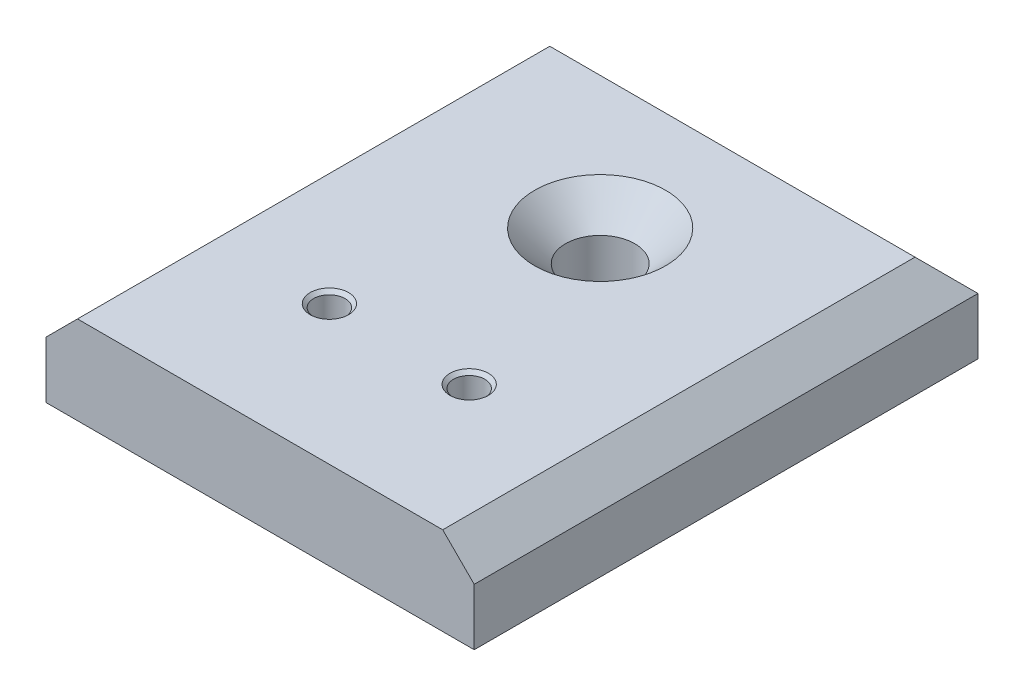
ISO-10303-21;
HEADER;
FILE_DESCRIPTION(('STEP AP214'),'2;1');
FILE_NAME('part.step','',(''),(''),'','','');
FILE_SCHEMA(('AUTOMOTIVE_DESIGN { 1 0 10303 214 1 1 1 1 }'));
ENDSEC;
DATA;
#1=APPLICATION_CONTEXT('core data for automotive mechanical design processes');
#2=APPLICATION_PROTOCOL_DEFINITION('international standard','automotive_design',2000,#1);
#3=PRODUCT_CONTEXT('',#1,'mechanical');
#4=PRODUCT('Part','Part','',(#3));
#5=PRODUCT_RELATED_PRODUCT_CATEGORY('part','',(#4));
#6=PRODUCT_DEFINITION_FORMATION('','',#4);
#7=PRODUCT_DEFINITION_CONTEXT('part definition',#1,'design');
#8=PRODUCT_DEFINITION('design','',#6,#7);
#9=PRODUCT_DEFINITION_SHAPE('','',#8);
#10=(LENGTH_UNIT() NAMED_UNIT(*) SI_UNIT(.MILLI.,.METRE.));
#11=(NAMED_UNIT(*) PLANE_ANGLE_UNIT() SI_UNIT($,.RADIAN.));
#12=(NAMED_UNIT(*) SI_UNIT($,.STERADIAN.) SOLID_ANGLE_UNIT());
#13=UNCERTAINTY_MEASURE_WITH_UNIT(LENGTH_MEASURE(1.E-05),#10,'distance_accuracy_value','');
#14=(GEOMETRIC_REPRESENTATION_CONTEXT(3) GLOBAL_UNCERTAINTY_ASSIGNED_CONTEXT((#13)) GLOBAL_UNIT_ASSIGNED_CONTEXT((#10,
#11,#12)) REPRESENTATION_CONTEXT('',''));
#15=CARTESIAN_POINT('',(0.,0.,0.));
#16=DIRECTION('',(0.,0.,1.));
#17=DIRECTION('',(1.,0.,0.));
#18=AXIS2_PLACEMENT_3D('',#15,#16,#17);
#19=CARTESIAN_POINT('',(17.,7.,-20.));
#20=DIRECTION('',(-1.,0.,0.));
#21=DIRECTION('',(0.,0.,1.));
#22=AXIS2_PLACEMENT_3D('',#19,#20,#21);
#23=PLANE('',#22);
#24=DIRECTION('',(0.,-1.,0.));
#25=VECTOR('',#24,1.);
#26=CARTESIAN_POINT('',(17.,7.,-20.));
#27=LINE('',#26,#25);
#28=CARTESIAN_POINT('',(17.,4.49999999999999,-20.));
#29=VERTEX_POINT('',#28);
#30=CARTESIAN_POINT('',(17.,0.,-20.));
#31=VERTEX_POINT('',#30);
#32=EDGE_CURVE('E91',#29,#31,#27,.T.);
#33=ORIENTED_EDGE('',*,*,#32,.F.);
#34=DIRECTION('',(0.,0.,1.));
#35=VECTOR('',#34,1.);
#36=CARTESIAN_POINT('',(17.,4.49999999999999,20.));
#37=LINE('',#36,#35);
#38=CARTESIAN_POINT('',(17.,4.49999999999999,20.));
#39=VERTEX_POINT('',#38);
#40=EDGE_CURVE('E135',#29,#39,#37,.T.);
#41=ORIENTED_EDGE('',*,*,#40,.T.);
#42=DIRECTION('',(0.,-1.,0.));
#43=VECTOR('',#42,1.);
#44=CARTESIAN_POINT('',(17.,7.,20.));
#45=LINE('',#44,#43);
#46=CARTESIAN_POINT('',(17.,0.,20.));
#47=VERTEX_POINT('',#46);
#48=EDGE_CURVE('E112',#39,#47,#45,.T.);
#49=ORIENTED_EDGE('',*,*,#48,.T.);
#50=DIRECTION('',(0.,0.,-1.));
#51=VECTOR('',#50,1.);
#52=CARTESIAN_POINT('',(17.,0.,-20.));
#53=LINE('',#52,#51);
#54=EDGE_CURVE('E107',#47,#31,#53,.T.);
#55=ORIENTED_EDGE('',*,*,#54,.T.);
#56=EDGE_LOOP('',(#33,#41,#49,#55));
#57=FACE_BOUND('',#56,.T.);
#58=ADVANCED_FACE('F37',(#57),#23,.F.);
#59=CARTESIAN_POINT('',(-17.,7.,-20.));
#60=DIRECTION('',(0.,0.,1.));
#61=DIRECTION('',(1.,0.,0.));
#62=AXIS2_PLACEMENT_3D('',#59,#60,#61);
#63=PLANE('',#62);
#64=DIRECTION('',(0.,-1.,0.));
#65=VECTOR('',#64,1.);
#66=CARTESIAN_POINT('',(-17.,7.,-20.));
#67=LINE('',#66,#65);
#68=CARTESIAN_POINT('',(-17.,4.49999999999999,-20.));
#69=VERTEX_POINT('',#68);
#70=CARTESIAN_POINT('',(-17.,0.,-20.));
#71=VERTEX_POINT('',#70);
#72=EDGE_CURVE('E101',#69,#71,#67,.T.);
#73=ORIENTED_EDGE('',*,*,#72,.F.);
#74=DIRECTION('',(1.,0.,0.));
#75=VECTOR('',#74,1.);
#76=CARTESIAN_POINT('',(17.,4.49999999999999,-20.));
#77=LINE('',#76,#75);
#78=EDGE_CURVE('E46',#69,#29,#77,.T.);
#79=ORIENTED_EDGE('',*,*,#78,.T.);
#80=ORIENTED_EDGE('',*,*,#32,.T.);
#81=DIRECTION('',(-1.,0.,0.));
#82=VECTOR('',#81,1.);
#83=CARTESIAN_POINT('',(-17.,0.,-20.));
#84=LINE('',#83,#82);
#85=EDGE_CURVE('E94',#31,#71,#84,.T.);
#86=ORIENTED_EDGE('',*,*,#85,.T.);
#87=EDGE_LOOP('',(#73,#79,#80,#86));
#88=FACE_BOUND('',#87,.T.);
#89=ADVANCED_FACE('F93',(#88),#63,.F.);
#90=CARTESIAN_POINT('',(-17.,7.,-20.));
#91=DIRECTION('',(1.,0.,0.));
#92=DIRECTION('',(0.,0.,-1.));
#93=AXIS2_PLACEMENT_3D('',#90,#91,#92);
#94=PLANE('',#93);
#95=DIRECTION('',(0.,-1.,0.));
#96=VECTOR('',#95,1.);
#97=CARTESIAN_POINT('',(-17.,7.,20.));
#98=LINE('',#97,#96);
#99=CARTESIAN_POINT('',(-17.,4.49999999999999,20.));
#100=VERTEX_POINT('',#99);
#101=CARTESIAN_POINT('',(-17.,0.,20.));
#102=VERTEX_POINT('',#101);
#103=EDGE_CURVE('E126',#100,#102,#98,.T.);
#104=ORIENTED_EDGE('',*,*,#103,.F.);
#105=DIRECTION('',(0.,0.,-1.));
#106=VECTOR('',#105,1.);
#107=CARTESIAN_POINT('',(-17.,4.49999999999999,-20.));
#108=LINE('',#107,#106);
#109=EDGE_CURVE('E11',#100,#69,#108,.T.);
#110=ORIENTED_EDGE('',*,*,#109,.T.);
#111=ORIENTED_EDGE('',*,*,#72,.T.);
#112=DIRECTION('',(0.,0.,1.));
#113=VECTOR('',#112,1.);
#114=CARTESIAN_POINT('',(-17.,0.,-20.));
#115=LINE('',#114,#113);
#116=EDGE_CURVE('E109',#71,#102,#115,.T.);
#117=ORIENTED_EDGE('',*,*,#116,.T.);
#118=EDGE_LOOP('',(#104,#110,#111,#117));
#119=FACE_BOUND('',#118,.T.);
#120=ADVANCED_FACE('F194',(#119),#94,.F.);
#121=CARTESIAN_POINT('',(-17.,7.,20.));
#122=DIRECTION('',(0.,0.,-1.));
#123=DIRECTION('',(-1.,0.,0.));
#124=AXIS2_PLACEMENT_3D('',#121,#122,#123);
#125=PLANE('',#124);
#126=ORIENTED_EDGE('',*,*,#48,.F.);
#127=DIRECTION('',(-0.707106781186546,0.70710678118655,0.));
#128=VECTOR('',#127,1.);
#129=CARTESIAN_POINT('',(14.5,7.,20.));
#130=LINE('',#129,#128);
#131=CARTESIAN_POINT('',(14.5,7.,20.));
#132=VERTEX_POINT('',#131);
#133=EDGE_CURVE('E138',#39,#132,#130,.T.);
#134=ORIENTED_EDGE('',*,*,#133,.T.);
#135=DIRECTION('',(1.,0.,0.));
#136=VECTOR('',#135,1.);
#137=CARTESIAN_POINT('',(-17.,7.,20.));
#138=LINE('',#137,#136);
#139=CARTESIAN_POINT('',(-14.5,7.,20.));
#140=VERTEX_POINT('',#139);
#141=EDGE_CURVE('E120',#140,#132,#138,.T.);
#142=ORIENTED_EDGE('',*,*,#141,.F.);
#143=DIRECTION('',(-0.707106781186546,-0.70710678118655,0.));
#144=VECTOR('',#143,1.);
#145=CARTESIAN_POINT('',(-14.5,7.,20.));
#146=LINE('',#145,#144);
#147=EDGE_CURVE('E60',#140,#100,#146,.T.);
#148=ORIENTED_EDGE('',*,*,#147,.T.);
#149=ORIENTED_EDGE('',*,*,#103,.T.);
#150=DIRECTION('',(1.,0.,0.));
#151=VECTOR('',#150,1.);
#152=CARTESIAN_POINT('',(-17.,0.,20.));
#153=LINE('',#152,#151);
#154=EDGE_CURVE('E123',#102,#47,#153,.T.);
#155=ORIENTED_EDGE('',*,*,#154,.T.);
#156=EDGE_LOOP('',(#126,#134,#142,#148,#149,#155));
#157=FACE_BOUND('',#156,.T.);
#158=ADVANCED_FACE('F187',(#157),#125,.F.);
#159=CARTESIAN_POINT('',(0.,7.,0.));
#160=DIRECTION('',(0.,1.,0.));
#161=DIRECTION('',(0.,0.,1.));
#162=AXIS2_PLACEMENT_3D('',#159,#160,#161);
#163=PLANE('',#162);
#164=CARTESIAN_POINT('',(-5.54999999999931,7.,8.94999999999997));
#165=DIRECTION('',(0.,1.,0.));
#166=DIRECTION('',(0.,0.,1.));
#167=AXIS2_PLACEMENT_3D('',#164,#165,#166);
#168=CIRCLE('',#167,1.525);
#169=CARTESIAN_POINT('',(-5.54999999999931,7.,10.475));
#170=VERTEX_POINT('',#169);
#171=EDGE_CURVE('E146',#170,#170,#168,.T.);
#172=ORIENTED_EDGE('',*,*,#171,.F.);
#173=EDGE_LOOP('',(#172));
#174=FACE_BOUND('',#173,.T.);
#175=CARTESIAN_POINT('',(5.54999999999931,7.,8.94999999999997));
#176=DIRECTION('',(0.,1.,0.));
#177=DIRECTION('',(0.,0.,1.));
#178=AXIS2_PLACEMENT_3D('',#175,#176,#177);
#179=CIRCLE('',#178,1.525);
#180=CARTESIAN_POINT('',(5.54999999999931,7.,10.475));
#181=VERTEX_POINT('',#180);
#182=EDGE_CURVE('E160',#181,#181,#179,.T.);
#183=ORIENTED_EDGE('',*,*,#182,.F.);
#184=EDGE_LOOP('',(#183));
#185=FACE_BOUND('',#184,.T.);
#186=CARTESIAN_POINT('',(0.,7.,-7.00000000000001));
#187=DIRECTION('',(0.,1.,0.));
#188=DIRECTION('',(0.,0.,1.));
#189=AXIS2_PLACEMENT_3D('',#186,#187,#188);
#190=CIRCLE('',#189,5.2);
#191=CARTESIAN_POINT('',(0.,7.,-1.80000000000001));
#192=VERTEX_POINT('',#191);
#193=EDGE_CURVE('E169',#192,#192,#190,.T.);
#194=ORIENTED_EDGE('',*,*,#193,.F.);
#195=EDGE_LOOP('',(#194));
#196=FACE_BOUND('',#195,.T.);
#197=ORIENTED_EDGE('',*,*,#141,.T.);
#198=DIRECTION('',(0.,0.,-1.));
#199=VECTOR('',#198,1.);
#200=CARTESIAN_POINT('',(14.5,7.,-20.));
#201=LINE('',#200,#199);
#202=CARTESIAN_POINT('',(14.5,7.,-17.5));
#203=VERTEX_POINT('',#202);
#204=EDGE_CURVE('E132',#132,#203,#201,.T.);
#205=ORIENTED_EDGE('',*,*,#204,.T.);
#206=DIRECTION('',(-1.,0.,0.));
#207=VECTOR('',#206,1.);
#208=CARTESIAN_POINT('',(-17.,7.,-17.5));
#209=LINE('',#208,#207);
#210=CARTESIAN_POINT('',(-14.5,7.,-17.5));
#211=VERTEX_POINT('',#210);
#212=EDGE_CURVE('E130',#203,#211,#209,.T.);
#213=ORIENTED_EDGE('',*,*,#212,.T.);
#214=DIRECTION('',(0.,0.,1.));
#215=VECTOR('',#214,1.);
#216=CARTESIAN_POINT('',(-14.5,7.,20.));
#217=LINE('',#216,#215);
#218=EDGE_CURVE('E100',#211,#140,#217,.T.);
#219=ORIENTED_EDGE('',*,*,#218,.T.);
#220=EDGE_LOOP('',(#197,#205,#213,#219));
#221=FACE_BOUND('',#220,.T.);
#222=ADVANCED_FACE('F184',(#174,#185,#196,#221),#163,.T.);
#223=CARTESIAN_POINT('',(0.,0.,0.));
#224=DIRECTION('',(0.,1.,0.));
#225=DIRECTION('',(0.,0.,1.));
#226=AXIS2_PLACEMENT_3D('',#223,#224,#225);
#227=PLANE('',#226);
#228=CARTESIAN_POINT('',(-5.54999999999931,0.,8.94999999999997));
#229=DIRECTION('',(0.,1.,0.));
#230=DIRECTION('',(0.,0.,1.));
#231=AXIS2_PLACEMENT_3D('',#228,#229,#230);
#232=CIRCLE('',#231,1.25);
#233=CARTESIAN_POINT('',(-5.54999999999931,0.,10.2));
#234=VERTEX_POINT('',#233);
#235=EDGE_CURVE('E155',#234,#234,#232,.T.);
#236=ORIENTED_EDGE('',*,*,#235,.T.);
#237=EDGE_LOOP('',(#236));
#238=FACE_BOUND('',#237,.T.);
#239=CARTESIAN_POINT('',(5.54999999999931,0.,8.94999999999997));
#240=DIRECTION('',(0.,1.,0.));
#241=DIRECTION('',(0.,0.,1.));
#242=AXIS2_PLACEMENT_3D('',#239,#240,#241);
#243=CIRCLE('',#242,1.25);
#244=CARTESIAN_POINT('',(5.54999999999931,0.,10.2));
#245=VERTEX_POINT('',#244);
#246=EDGE_CURVE('E166',#245,#245,#243,.T.);
#247=ORIENTED_EDGE('',*,*,#246,.T.);
#248=EDGE_LOOP('',(#247));
#249=FACE_BOUND('',#248,.T.);
#250=CARTESIAN_POINT('',(0.,0.,-7.00000000000001));
#251=DIRECTION('',(0.,1.,0.));
#252=DIRECTION('',(0.,0.,1.));
#253=AXIS2_PLACEMENT_3D('',#250,#251,#252);
#254=CIRCLE('',#253,2.75);
#255=CARTESIAN_POINT('',(0.,0.,-4.25000000000001));
#256=VERTEX_POINT('',#255);
#257=EDGE_CURVE('E114',#256,#256,#254,.T.);
#258=ORIENTED_EDGE('',*,*,#257,.T.);
#259=EDGE_LOOP('',(#258));
#260=FACE_BOUND('',#259,.T.);
#261=ORIENTED_EDGE('',*,*,#54,.F.);
#262=ORIENTED_EDGE('',*,*,#154,.F.);
#263=ORIENTED_EDGE('',*,*,#116,.F.);
#264=ORIENTED_EDGE('',*,*,#85,.F.);
#265=EDGE_LOOP('',(#261,#262,#263,#264));
#266=FACE_BOUND('',#265,.T.);
#267=ADVANCED_FACE('F105',(#238,#249,#260,#266),#227,.F.);
#268=CARTESIAN_POINT('',(0.,7.,-7.00000000000001));
#269=DIRECTION('',(0.,1.,0.));
#270=DIRECTION('',(0.,0.,1.));
#271=AXIS2_PLACEMENT_3D('',#268,#269,#270);
#272=CYLINDRICAL_SURFACE('',#271,2.74999999999999);
#273=ORIENTED_EDGE('',*,*,#257,.F.);
#274=EDGE_LOOP('',(#273));
#275=FACE_BOUND('',#274,.T.);
#276=CARTESIAN_POINT('',(0.,4.54999999999999,-7.00000000000001));
#277=DIRECTION('',(0.,1.,0.));
#278=DIRECTION('',(0.,0.,1.));
#279=AXIS2_PLACEMENT_3D('',#276,#277,#278);
#280=CIRCLE('',#279,2.74999999999999);
#281=CARTESIAN_POINT('',(0.,4.54999999999999,-4.25000000000002));
#282=VERTEX_POINT('',#281);
#283=EDGE_CURVE('E117',#282,#282,#280,.T.);
#284=ORIENTED_EDGE('',*,*,#283,.T.);
#285=EDGE_LOOP('',(#284));
#286=FACE_BOUND('',#285,.T.);
#287=ADVANCED_FACE('F175',(#275,#286),#272,.F.);
#288=CARTESIAN_POINT('',(0.,7.,-7.00000000000001));
#289=DIRECTION('',(0.,1.,0.));
#290=DIRECTION('',(0.,0.,1.));
#291=AXIS2_PLACEMENT_3D('',#288,#289,#290);
#292=CONICAL_SURFACE('',#291,5.2,0.785398163397449);
#293=ORIENTED_EDGE('',*,*,#283,.F.);
#294=EDGE_LOOP('',(#293));
#295=FACE_BOUND('',#294,.T.);
#296=ORIENTED_EDGE('',*,*,#193,.T.);
#297=EDGE_LOOP('',(#296));
#298=FACE_BOUND('',#297,.T.);
#299=ADVANCED_FACE('F177',(#295,#298),#292,.F.);
#300=CARTESIAN_POINT('',(5.54999999999931,7.,8.94999999999997));
#301=DIRECTION('',(0.,1.,0.));
#302=DIRECTION('',(0.,0.,1.));
#303=AXIS2_PLACEMENT_3D('',#300,#301,#302);
#304=CYLINDRICAL_SURFACE('',#303,1.25);
#305=ORIENTED_EDGE('',*,*,#246,.F.);
#306=EDGE_LOOP('',(#305));
#307=FACE_BOUND('',#306,.T.);
#308=CARTESIAN_POINT('',(5.54999999999931,6.725,8.94999999999997));
#309=DIRECTION('',(0.,1.,0.));
#310=DIRECTION('',(0.,0.,1.));
#311=AXIS2_PLACEMENT_3D('',#308,#309,#310);
#312=CIRCLE('',#311,1.25);
#313=CARTESIAN_POINT('',(5.54999999999931,6.725,10.2));
#314=VERTEX_POINT('',#313);
#315=EDGE_CURVE('E163',#314,#314,#312,.T.);
#316=ORIENTED_EDGE('',*,*,#315,.T.);
#317=EDGE_LOOP('',(#316));
#318=FACE_BOUND('',#317,.T.);
#319=ADVANCED_FACE('F180',(#307,#318),#304,.F.);
#320=CARTESIAN_POINT('',(5.54999999999931,7.,8.94999999999997));
#321=DIRECTION('',(0.,1.,0.));
#322=DIRECTION('',(0.,0.,1.));
#323=AXIS2_PLACEMENT_3D('',#320,#321,#322);
#324=CONICAL_SURFACE('',#323,1.525,0.785398163397453);
#325=ORIENTED_EDGE('',*,*,#315,.F.);
#326=EDGE_LOOP('',(#325));
#327=FACE_BOUND('',#326,.T.);
#328=ORIENTED_EDGE('',*,*,#182,.T.);
#329=EDGE_LOOP('',(#328));
#330=FACE_BOUND('',#329,.T.);
#331=ADVANCED_FACE('F223',(#327,#330),#324,.F.);
#332=CARTESIAN_POINT('',(-5.54999999999931,7.,8.94999999999997));
#333=DIRECTION('',(0.,1.,0.));
#334=DIRECTION('',(0.,0.,1.));
#335=AXIS2_PLACEMENT_3D('',#332,#333,#334);
#336=CYLINDRICAL_SURFACE('',#335,1.25);
#337=ORIENTED_EDGE('',*,*,#235,.F.);
#338=EDGE_LOOP('',(#337));
#339=FACE_BOUND('',#338,.T.);
#340=CARTESIAN_POINT('',(-5.54999999999931,6.725,8.94999999999997));
#341=DIRECTION('',(0.,1.,0.));
#342=DIRECTION('',(0.,0.,1.));
#343=AXIS2_PLACEMENT_3D('',#340,#341,#342);
#344=CIRCLE('',#343,1.25);
#345=CARTESIAN_POINT('',(-5.54999999999931,6.725,10.2));
#346=VERTEX_POINT('',#345);
#347=EDGE_CURVE('E150',#346,#346,#344,.T.);
#348=ORIENTED_EDGE('',*,*,#347,.T.);
#349=EDGE_LOOP('',(#348));
#350=FACE_BOUND('',#349,.T.);
#351=ADVANCED_FACE('F227',(#339,#350),#336,.F.);
#352=CARTESIAN_POINT('',(-5.54999999999931,7.,8.94999999999997));
#353=DIRECTION('',(0.,1.,0.));
#354=DIRECTION('',(0.,0.,1.));
#355=AXIS2_PLACEMENT_3D('',#352,#353,#354);
#356=CONICAL_SURFACE('',#355,1.525,0.785398163397453);
#357=ORIENTED_EDGE('',*,*,#347,.F.);
#358=EDGE_LOOP('',(#357));
#359=FACE_BOUND('',#358,.T.);
#360=ORIENTED_EDGE('',*,*,#171,.T.);
#361=EDGE_LOOP('',(#360));
#362=FACE_BOUND('',#361,.T.);
#363=ADVANCED_FACE('F203',(#359,#362),#356,.F.);
#364=CARTESIAN_POINT('',(-14.5,7.,0.));
#365=DIRECTION('',(-0.707106781186549,0.707106781186545,0.));
#366=DIRECTION('',(0.,0.,-1.));
#367=AXIS2_PLACEMENT_3D('',#364,#365,#366);
#368=PLANE('',#367);
#369=ORIENTED_EDGE('',*,*,#147,.F.);
#370=ORIENTED_EDGE('',*,*,#218,.F.);
#371=DIRECTION('',(-0.577350269189625,-0.577350269189628,-0.577350269189625));
#372=VECTOR('',#371,1.);
#373=CARTESIAN_POINT('',(-8.6666666666667,12.8333333333333,-11.6666666666667));
#374=LINE('',#373,#372);
#375=EDGE_CURVE('E41',#69,#211,#374,.F.);
#376=ORIENTED_EDGE('',*,*,#375,.F.);
#377=ORIENTED_EDGE('',*,*,#109,.F.);
#378=EDGE_LOOP('',(#369,#370,#376,#377));
#379=FACE_BOUND('',#378,.T.);
#380=ADVANCED_FACE('F39',(#379),#368,.T.);
#381=CARTESIAN_POINT('',(0.,7.,-17.5));
#382=DIRECTION('',(0.,0.707106781186545,-0.707106781186549));
#383=DIRECTION('',(1.,0.,0.));
#384=AXIS2_PLACEMENT_3D('',#381,#382,#383);
#385=PLANE('',#384);
#386=ORIENTED_EDGE('',*,*,#375,.T.);
#387=ORIENTED_EDGE('',*,*,#212,.F.);
#388=DIRECTION('',(0.577350269189625,-0.577350269189628,-0.577350269189625));
#389=VECTOR('',#388,1.);
#390=CARTESIAN_POINT('',(9.66666666666668,11.8333333333333,-12.6666666666667));
#391=LINE('',#390,#389);
#392=EDGE_CURVE('E140',#29,#203,#391,.F.);
#393=ORIENTED_EDGE('',*,*,#392,.F.);
#394=ORIENTED_EDGE('',*,*,#78,.F.);
#395=EDGE_LOOP('',(#386,#387,#393,#394));
#396=FACE_BOUND('',#395,.T.);
#397=ADVANCED_FACE('F196',(#396),#385,.T.);
#398=CARTESIAN_POINT('',(14.5,7.,0.));
#399=DIRECTION('',(0.707106781186549,0.707106781186545,0.));
#400=DIRECTION('',(0.,0.,1.));
#401=AXIS2_PLACEMENT_3D('',#398,#399,#400);
#402=PLANE('',#401);
#403=ORIENTED_EDGE('',*,*,#133,.F.);
#404=ORIENTED_EDGE('',*,*,#40,.F.);
#405=ORIENTED_EDGE('',*,*,#392,.T.);
#406=ORIENTED_EDGE('',*,*,#204,.F.);
#407=EDGE_LOOP('',(#403,#404,#405,#406));
#408=FACE_BOUND('',#407,.T.);
#409=ADVANCED_FACE('F193',(#408),#402,.T.);
#410=CLOSED_SHELL('',(#58,#89,#120,#158,#222,#267,#287,#299,#319,#331,#351,#363,#380,#397,#409));
#411=MANIFOLD_SOLID_BREP('B2',#410);
#412=ADVANCED_BREP_SHAPE_REPRESENTATION('',(#18,#411),#14);
#413=SHAPE_DEFINITION_REPRESENTATION(#9,#412);
ENDSEC;
END-ISO-10303-21;
